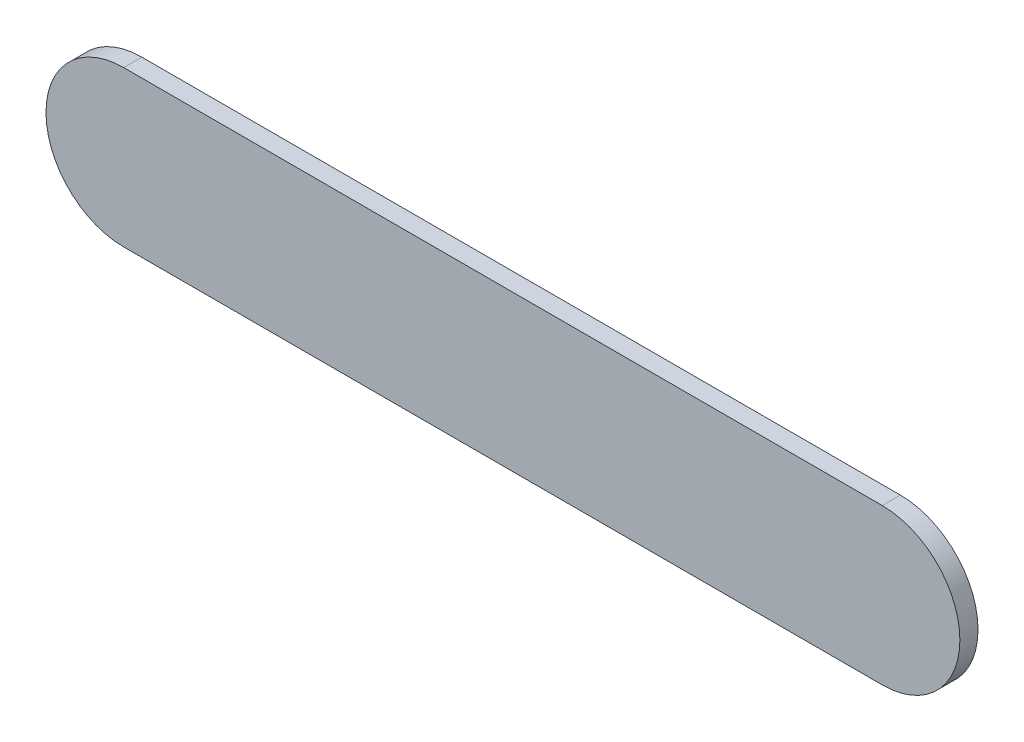
ISO-10303-21;
HEADER;
FILE_DESCRIPTION(('STEP AP214'),'2;1');
FILE_NAME('part.step','',(''),(''),'','','');
FILE_SCHEMA(('AUTOMOTIVE_DESIGN { 1 0 10303 214 1 1 1 1 }'));
ENDSEC;
DATA;
#1=APPLICATION_CONTEXT('core data for automotive mechanical design processes');
#2=APPLICATION_PROTOCOL_DEFINITION('international standard','automotive_design',2000,#1);
#3=PRODUCT_CONTEXT('',#1,'mechanical');
#4=PRODUCT('Part','Part','',(#3));
#5=PRODUCT_RELATED_PRODUCT_CATEGORY('part','',(#4));
#6=PRODUCT_DEFINITION_FORMATION('','',#4);
#7=PRODUCT_DEFINITION_CONTEXT('part definition',#1,'design');
#8=PRODUCT_DEFINITION('design','',#6,#7);
#9=PRODUCT_DEFINITION_SHAPE('','',#8);
#10=(LENGTH_UNIT() NAMED_UNIT(*) SI_UNIT(.MILLI.,.METRE.));
#11=(NAMED_UNIT(*) PLANE_ANGLE_UNIT() SI_UNIT($,.RADIAN.));
#12=(NAMED_UNIT(*) SI_UNIT($,.STERADIAN.) SOLID_ANGLE_UNIT());
#13=UNCERTAINTY_MEASURE_WITH_UNIT(LENGTH_MEASURE(1.E-05),#10,'distance_accuracy_value','');
#14=(GEOMETRIC_REPRESENTATION_CONTEXT(3) GLOBAL_UNCERTAINTY_ASSIGNED_CONTEXT((#13)) GLOBAL_UNIT_ASSIGNED_CONTEXT((#10,
#11,#12)) REPRESENTATION_CONTEXT('',''));
#15=CARTESIAN_POINT('',(0.,0.,0.));
#16=DIRECTION('',(0.,0.,1.));
#17=DIRECTION('',(1.,0.,0.));
#18=AXIS2_PLACEMENT_3D('',#15,#16,#17);
#19=CARTESIAN_POINT('',(122.7,-116.4,1.635));
#20=DIRECTION('',(0.,0.,1.));
#21=DIRECTION('',(1.,0.,0.));
#22=AXIS2_PLACEMENT_3D('',#19,#20,#21);
#23=PLANE('',#22);
#24=DIRECTION('',(-1.,0.,0.));
#25=VECTOR('',#24,1.);
#26=CARTESIAN_POINT('',(122.7,-116.4,1.635));
#27=LINE('',#26,#25);
#28=CARTESIAN_POINT('',(122.7,-116.4,1.635));
#29=VERTEX_POINT('',#28);
#30=CARTESIAN_POINT('',(121.235,-116.4,1.635));
#31=VERTEX_POINT('',#30);
#32=EDGE_CURVE('E103',#29,#31,#27,.T.);
#33=ORIENTED_EDGE('',*,*,#32,.T.);
#34=CARTESIAN_POINT('',(121.235,-116.55,1.635));
#35=DIRECTION('',(0.,0.,1.));
#36=DIRECTION('',(0.,1.,0.));
#37=AXIS2_PLACEMENT_3D('',#34,#35,#36);
#38=CIRCLE('',#37,0.15);
#39=CARTESIAN_POINT('',(121.235,-116.7,1.635));
#40=VERTEX_POINT('',#39);
#41=EDGE_CURVE('E66',#31,#40,#38,.T.);
#42=ORIENTED_EDGE('',*,*,#41,.T.);
#43=DIRECTION('',(1.,0.,0.));
#44=VECTOR('',#43,1.);
#45=CARTESIAN_POINT('',(121.235,-116.7,1.635));
#46=LINE('',#45,#44);
#47=CARTESIAN_POINT('',(122.7,-116.7,1.635));
#48=VERTEX_POINT('',#47);
#49=EDGE_CURVE('E89',#40,#48,#46,.T.);
#50=ORIENTED_EDGE('',*,*,#49,.T.);
#51=CARTESIAN_POINT('',(122.7,-116.55,1.635));
#52=DIRECTION('',(0.,0.,1.));
#53=DIRECTION('',(0.,-1.,0.));
#54=AXIS2_PLACEMENT_3D('',#51,#52,#53);
#55=CIRCLE('',#54,0.15);
#56=EDGE_CURVE('E11',#48,#29,#55,.T.);
#57=ORIENTED_EDGE('',*,*,#56,.T.);
#58=EDGE_LOOP('',(#33,#42,#50,#57));
#59=FACE_BOUND('',#58,.T.);
#60=ADVANCED_FACE('F17',(#59),#23,.T.);
#61=CARTESIAN_POINT('',(122.7,-116.4,1.6));
#62=DIRECTION('',(0.,0.,1.));
#63=DIRECTION('',(1.,0.,0.));
#64=AXIS2_PLACEMENT_3D('',#61,#62,#63);
#65=PLANE('',#64);
#66=CARTESIAN_POINT('',(122.7,-116.55,1.6));
#67=DIRECTION('',(0.,0.,1.));
#68=DIRECTION('',(0.,-1.,0.));
#69=AXIS2_PLACEMENT_3D('',#66,#67,#68);
#70=CIRCLE('',#69,0.15);
#71=CARTESIAN_POINT('',(122.7,-116.7,1.6));
#72=VERTEX_POINT('',#71);
#73=CARTESIAN_POINT('',(122.7,-116.4,1.6));
#74=VERTEX_POINT('',#73);
#75=EDGE_CURVE('E26',#72,#74,#70,.T.);
#76=ORIENTED_EDGE('',*,*,#75,.F.);
#77=DIRECTION('',(1.,0.,0.));
#78=VECTOR('',#77,1.);
#79=CARTESIAN_POINT('',(121.235,-116.7,1.6));
#80=LINE('',#79,#78);
#81=CARTESIAN_POINT('',(121.235,-116.7,1.6));
#82=VERTEX_POINT('',#81);
#83=EDGE_CURVE('E81',#82,#72,#80,.T.);
#84=ORIENTED_EDGE('',*,*,#83,.F.);
#85=CARTESIAN_POINT('',(121.235,-116.55,1.6));
#86=DIRECTION('',(0.,0.,1.));
#87=DIRECTION('',(0.,1.,0.));
#88=AXIS2_PLACEMENT_3D('',#85,#86,#87);
#89=CIRCLE('',#88,0.15);
#90=CARTESIAN_POINT('',(121.235,-116.4,1.6));
#91=VERTEX_POINT('',#90);
#92=EDGE_CURVE('E73',#91,#82,#89,.T.);
#93=ORIENTED_EDGE('',*,*,#92,.F.);
#94=DIRECTION('',(-1.,0.,0.));
#95=VECTOR('',#94,1.);
#96=CARTESIAN_POINT('',(122.7,-116.4,1.6));
#97=LINE('',#96,#95);
#98=EDGE_CURVE('E118',#74,#91,#97,.T.);
#99=ORIENTED_EDGE('',*,*,#98,.F.);
#100=EDGE_LOOP('',(#76,#84,#93,#99));
#101=FACE_BOUND('',#100,.T.);
#102=ADVANCED_FACE('F83',(#101),#65,.F.);
#103=CARTESIAN_POINT('',(122.7,-116.55,1.6));
#104=DIRECTION('',(0.,0.,-1.));
#105=DIRECTION('',(0.,-1.,0.));
#106=AXIS2_PLACEMENT_3D('',#103,#104,#105);
#107=CYLINDRICAL_SURFACE('',#106,0.15);
#108=ORIENTED_EDGE('',*,*,#75,.T.);
#109=DIRECTION('',(0.,0.,1.));
#110=VECTOR('',#109,1.);
#111=CARTESIAN_POINT('',(122.7,-116.4,1.6));
#112=LINE('',#111,#110);
#113=EDGE_CURVE('E97',#74,#29,#112,.T.);
#114=ORIENTED_EDGE('',*,*,#113,.T.);
#115=ORIENTED_EDGE('',*,*,#56,.F.);
#116=DIRECTION('',(0.,0.,1.));
#117=VECTOR('',#116,1.);
#118=CARTESIAN_POINT('',(122.7,-116.7,1.6));
#119=LINE('',#118,#117);
#120=EDGE_CURVE('E20',#72,#48,#119,.T.);
#121=ORIENTED_EDGE('',*,*,#120,.F.);
#122=EDGE_LOOP('',(#108,#114,#115,#121));
#123=FACE_BOUND('',#122,.T.);
#124=ADVANCED_FACE('F178',(#123),#107,.T.);
#125=CARTESIAN_POINT('',(121.235,-116.7,1.6));
#126=DIRECTION('',(0.,1.,0.));
#127=DIRECTION('',(1.,0.,0.));
#128=AXIS2_PLACEMENT_3D('',#125,#126,#127);
#129=PLANE('',#128);
#130=ORIENTED_EDGE('',*,*,#83,.T.);
#131=ORIENTED_EDGE('',*,*,#120,.T.);
#132=ORIENTED_EDGE('',*,*,#49,.F.);
#133=DIRECTION('',(0.,0.,1.));
#134=VECTOR('',#133,1.);
#135=CARTESIAN_POINT('',(121.235,-116.7,1.6));
#136=LINE('',#135,#134);
#137=EDGE_CURVE('E87',#82,#40,#136,.T.);
#138=ORIENTED_EDGE('',*,*,#137,.F.);
#139=EDGE_LOOP('',(#130,#131,#132,#138));
#140=FACE_BOUND('',#139,.T.);
#141=ADVANCED_FACE('F88',(#140),#129,.F.);
#142=CARTESIAN_POINT('',(121.235,-116.55,1.6));
#143=DIRECTION('',(0.,0.,-1.));
#144=DIRECTION('',(0.,1.,0.));
#145=AXIS2_PLACEMENT_3D('',#142,#143,#144);
#146=CYLINDRICAL_SURFACE('',#145,0.15);
#147=ORIENTED_EDGE('',*,*,#92,.T.);
#148=ORIENTED_EDGE('',*,*,#137,.T.);
#149=ORIENTED_EDGE('',*,*,#41,.F.);
#150=DIRECTION('',(0.,0.,1.));
#151=VECTOR('',#150,1.);
#152=CARTESIAN_POINT('',(121.235,-116.4,1.6));
#153=LINE('',#152,#151);
#154=EDGE_CURVE('E94',#91,#31,#153,.T.);
#155=ORIENTED_EDGE('',*,*,#154,.F.);
#156=EDGE_LOOP('',(#147,#148,#149,#155));
#157=FACE_BOUND('',#156,.T.);
#158=ADVANCED_FACE('F92',(#157),#146,.T.);
#159=CARTESIAN_POINT('',(122.7,-116.4,1.6));
#160=DIRECTION('',(0.,-1.,0.));
#161=DIRECTION('',(0.,0.,-1.));
#162=AXIS2_PLACEMENT_3D('',#159,#160,#161);
#163=PLANE('',#162);
#164=ORIENTED_EDGE('',*,*,#98,.T.);
#165=ORIENTED_EDGE('',*,*,#154,.T.);
#166=ORIENTED_EDGE('',*,*,#32,.F.);
#167=ORIENTED_EDGE('',*,*,#113,.F.);
#168=EDGE_LOOP('',(#164,#165,#166,#167));
#169=FACE_BOUND('',#168,.T.);
#170=ADVANCED_FACE('F117',(#169),#163,.F.);
#171=CLOSED_SHELL('',(#60,#102,#124,#141,#158,#170));
#172=MANIFOLD_SOLID_BREP('B1',#171);
#173=ADVANCED_BREP_SHAPE_REPRESENTATION('',(#18,#172),#14);
#174=SHAPE_DEFINITION_REPRESENTATION(#9,#173);
ENDSEC;
END-ISO-10303-21;
